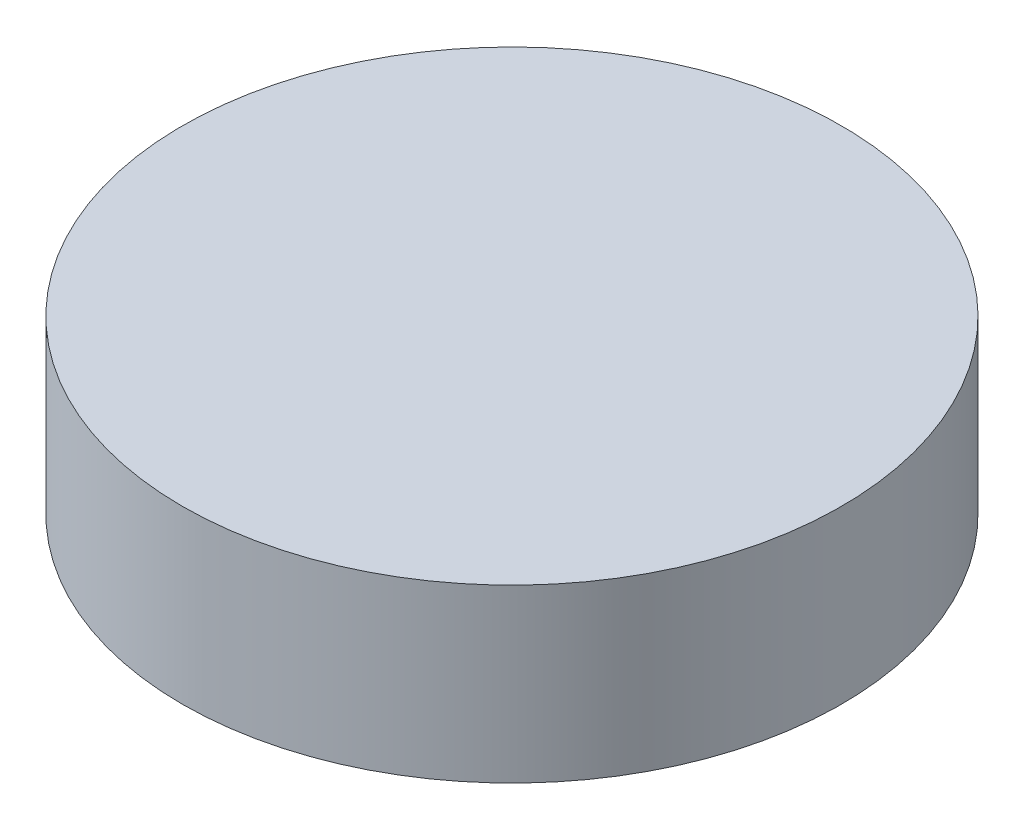
ISO-10303-21;
HEADER;
FILE_DESCRIPTION(('STEP AP214'),'2;1');
FILE_NAME('part.step','',(''),(''),'','','');
FILE_SCHEMA(('AUTOMOTIVE_DESIGN { 1 0 10303 214 1 1 1 1 }'));
ENDSEC;
DATA;
#1=APPLICATION_CONTEXT('core data for automotive mechanical design processes');
#2=APPLICATION_PROTOCOL_DEFINITION('international standard','automotive_design',2000,#1);
#3=PRODUCT_CONTEXT('',#1,'mechanical');
#4=PRODUCT('Part','Part','',(#3));
#5=PRODUCT_RELATED_PRODUCT_CATEGORY('part','',(#4));
#6=PRODUCT_DEFINITION_FORMATION('','',#4);
#7=PRODUCT_DEFINITION_CONTEXT('part definition',#1,'design');
#8=PRODUCT_DEFINITION('design','',#6,#7);
#9=PRODUCT_DEFINITION_SHAPE('','',#8);
#10=(LENGTH_UNIT() NAMED_UNIT(*) SI_UNIT(.MILLI.,.METRE.));
#11=(NAMED_UNIT(*) PLANE_ANGLE_UNIT() SI_UNIT($,.RADIAN.));
#12=(NAMED_UNIT(*) SI_UNIT($,.STERADIAN.) SOLID_ANGLE_UNIT());
#13=UNCERTAINTY_MEASURE_WITH_UNIT(LENGTH_MEASURE(1.E-05),#10,'distance_accuracy_value','');
#14=(GEOMETRIC_REPRESENTATION_CONTEXT(3) GLOBAL_UNCERTAINTY_ASSIGNED_CONTEXT((#13)) GLOBAL_UNIT_ASSIGNED_CONTEXT((#10,
#11,#12)) REPRESENTATION_CONTEXT('',''));
#15=CARTESIAN_POINT('',(0.,0.,0.));
#16=DIRECTION('',(0.,0.,1.));
#17=DIRECTION('',(1.,0.,0.));
#18=AXIS2_PLACEMENT_3D('',#15,#16,#17);
#19=CARTESIAN_POINT('',(0.,25.4,2.07620763552541));
#20=DIRECTION('',(0.,-1.,0.));
#21=DIRECTION('',(0.,0.,-1.));
#22=AXIS2_PLACEMENT_3D('',#19,#20,#21);
#23=CYLINDRICAL_SURFACE('',#22,48.8333364507226);
#24=CARTESIAN_POINT('',(0.,25.4,2.07620763552541));
#25=DIRECTION('',(0.,1.,0.));
#26=DIRECTION('',(0.,0.,1.));
#27=AXIS2_PLACEMENT_3D('',#24,#25,#26);
#28=CIRCLE('',#27,48.8333364507226);
#29=CARTESIAN_POINT('',(0.,25.4,50.909544086248));
#30=VERTEX_POINT('',#29);
#31=EDGE_CURVE('E10',#30,#30,#28,.T.);
#32=ORIENTED_EDGE('',*,*,#31,.F.);
#33=EDGE_LOOP('',(#32));
#34=FACE_BOUND('',#33,.T.);
#35=CARTESIAN_POINT('',(0.,0.,2.07620763552541));
#36=DIRECTION('',(0.,1.,0.));
#37=DIRECTION('',(0.,0.,1.));
#38=AXIS2_PLACEMENT_3D('',#35,#36,#37);
#39=CIRCLE('',#38,48.8333364507226);
#40=CARTESIAN_POINT('',(0.,0.,50.909544086248));
#41=VERTEX_POINT('',#40);
#42=EDGE_CURVE('E40',#41,#41,#39,.T.);
#43=ORIENTED_EDGE('',*,*,#42,.T.);
#44=EDGE_LOOP('',(#43));
#45=FACE_BOUND('',#44,.T.);
#46=ADVANCED_FACE('F37',(#34,#45),#23,.T.);
#47=CARTESIAN_POINT('',(0.,25.4,2.07620763552541));
#48=DIRECTION('',(0.,1.,0.));
#49=DIRECTION('',(0.,0.,1.));
#50=AXIS2_PLACEMENT_3D('',#47,#48,#49);
#51=PLANE('',#50);
#52=ORIENTED_EDGE('',*,*,#31,.T.);
#53=EDGE_LOOP('',(#52));
#54=FACE_BOUND('',#53,.T.);
#55=ADVANCED_FACE('F54',(#54),#51,.T.);
#56=CARTESIAN_POINT('',(0.,0.,2.07620763552541));
#57=DIRECTION('',(0.,1.,0.));
#58=DIRECTION('',(0.,0.,1.));
#59=AXIS2_PLACEMENT_3D('',#56,#57,#58);
#60=PLANE('',#59);
#61=ORIENTED_EDGE('',*,*,#42,.F.);
#62=EDGE_LOOP('',(#61));
#63=FACE_BOUND('',#62,.T.);
#64=ADVANCED_FACE('F52',(#63),#60,.F.);
#65=CLOSED_SHELL('',(#46,#55,#64));
#66=MANIFOLD_SOLID_BREP('B2',#65);
#67=ADVANCED_BREP_SHAPE_REPRESENTATION('',(#18,#66),#14);
#68=SHAPE_DEFINITION_REPRESENTATION(#9,#67);
ENDSEC;
END-ISO-10303-21;
